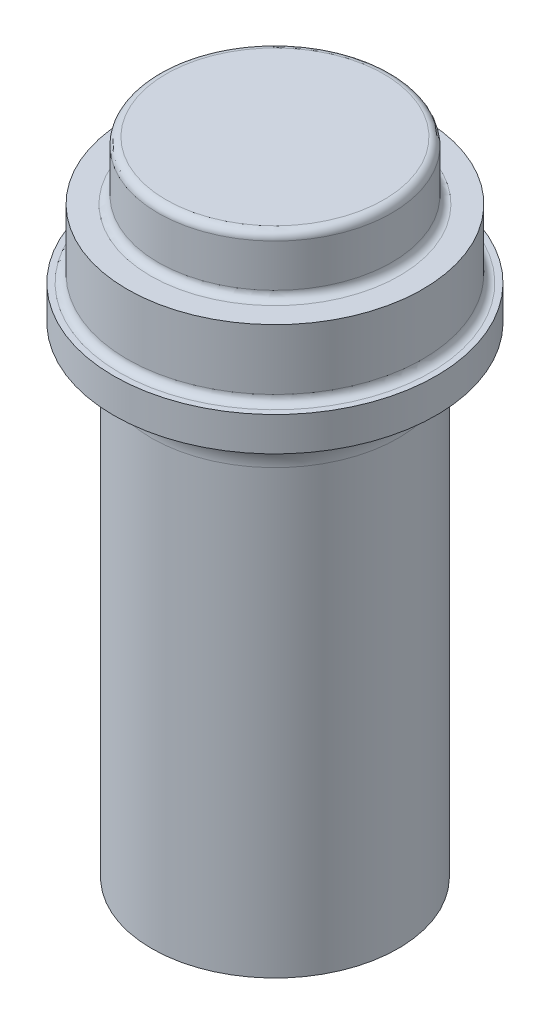
ISO-10303-21;
HEADER;
FILE_DESCRIPTION(('STEP AP214'),'2;1');
FILE_NAME('part.step','',(''),(''),'','','');
FILE_SCHEMA(('AUTOMOTIVE_DESIGN { 1 0 10303 214 1 1 1 1 }'));
ENDSEC;
DATA;
#1=APPLICATION_CONTEXT('core data for automotive mechanical design processes');
#2=APPLICATION_PROTOCOL_DEFINITION('international standard','automotive_design',2000,#1);
#3=PRODUCT_CONTEXT('',#1,'mechanical');
#4=PRODUCT('Part','Part','',(#3));
#5=PRODUCT_RELATED_PRODUCT_CATEGORY('part','',(#4));
#6=PRODUCT_DEFINITION_FORMATION('','',#4);
#7=PRODUCT_DEFINITION_CONTEXT('part definition',#1,'design');
#8=PRODUCT_DEFINITION('design','',#6,#7);
#9=PRODUCT_DEFINITION_SHAPE('','',#8);
#10=(LENGTH_UNIT() NAMED_UNIT(*) SI_UNIT(.MILLI.,.METRE.));
#11=(NAMED_UNIT(*) PLANE_ANGLE_UNIT() SI_UNIT($,.RADIAN.));
#12=(NAMED_UNIT(*) SI_UNIT($,.STERADIAN.) SOLID_ANGLE_UNIT());
#13=UNCERTAINTY_MEASURE_WITH_UNIT(LENGTH_MEASURE(1.E-05),#10,'distance_accuracy_value','');
#14=(GEOMETRIC_REPRESENTATION_CONTEXT(3) GLOBAL_UNCERTAINTY_ASSIGNED_CONTEXT((#13)) GLOBAL_UNIT_ASSIGNED_CONTEXT((#10,
#11,#12)) REPRESENTATION_CONTEXT('',''));
#15=CARTESIAN_POINT('',(0.,0.,0.));
#16=DIRECTION('',(0.,0.,1.));
#17=DIRECTION('',(1.,0.,0.));
#18=AXIS2_PLACEMENT_3D('',#15,#16,#17);
#19=CARTESIAN_POINT('',(0.,62.,0.));
#20=DIRECTION('',(0.,-1.,0.));
#21=DIRECTION('',(0.,0.,-1.));
#22=AXIS2_PLACEMENT_3D('',#19,#20,#21);
#23=CYLINDRICAL_SURFACE('',#22,15.9);
#24=CARTESIAN_POINT('',(0.,57.00100010002,0.));
#25=DIRECTION('',(0.,1.,0.));
#26=DIRECTION('',(0.,0.,1.));
#27=AXIS2_PLACEMENT_3D('',#24,#25,#26);
#28=CIRCLE('',#27,15.9);
#29=CARTESIAN_POINT('',(0.,57.00100010002,15.9));
#30=VERTEX_POINT('',#29);
#31=EDGE_CURVE('E60',#30,#30,#28,.F.);
#32=ORIENTED_EDGE('',*,*,#31,.T.);
#33=EDGE_LOOP('',(#32));
#34=FACE_BOUND('',#33,.T.);
#35=CARTESIAN_POINT('',(0.,0.,0.));
#36=DIRECTION('',(0.,1.,0.));
#37=DIRECTION('',(0.,0.,1.));
#38=AXIS2_PLACEMENT_3D('',#35,#36,#37);
#39=CIRCLE('',#38,15.9);
#40=CARTESIAN_POINT('',(0.,0.,15.9));
#41=VERTEX_POINT('',#40);
#42=EDGE_CURVE('E63',#41,#41,#39,.T.);
#43=ORIENTED_EDGE('',*,*,#42,.T.);
#44=EDGE_LOOP('',(#43));
#45=FACE_BOUND('',#44,.T.);
#46=ADVANCED_FACE('F34',(#34,#45),#23,.T.);
#47=CARTESIAN_POINT('',(0.,0.,0.));
#48=DIRECTION('',(0.,1.,0.));
#49=DIRECTION('',(0.,0.,1.));
#50=AXIS2_PLACEMENT_3D('',#47,#48,#49);
#51=PLANE('',#50);
#52=ORIENTED_EDGE('',*,*,#42,.F.);
#53=EDGE_LOOP('',(#52));
#54=FACE_BOUND('',#53,.T.);
#55=ADVANCED_FACE('F92',(#54),#51,.F.);
#56=CARTESIAN_POINT('',(0.,66.4,0.));
#57=DIRECTION('',(0.,-1.,0.));
#58=DIRECTION('',(0.,0.,-1.));
#59=AXIS2_PLACEMENT_3D('',#56,#57,#58);
#60=CYLINDRICAL_SURFACE('',#59,20.8);
#61=CARTESIAN_POINT('',(0.,66.4,0.));
#62=DIRECTION('',(0.,1.,0.));
#63=DIRECTION('',(0.,0.,1.));
#64=AXIS2_PLACEMENT_3D('',#61,#62,#63);
#65=CIRCLE('',#64,20.8);
#66=CARTESIAN_POINT('',(0.,66.4,20.8));
#67=VERTEX_POINT('',#66);
#68=EDGE_CURVE('E66',#67,#67,#65,.T.);
#69=ORIENTED_EDGE('',*,*,#68,.F.);
#70=EDGE_LOOP('',(#69));
#71=FACE_BOUND('',#70,.T.);
#72=CARTESIAN_POINT('',(0.,62.,0.));
#73=DIRECTION('',(0.,1.,0.));
#74=DIRECTION('',(0.,0.,1.));
#75=AXIS2_PLACEMENT_3D('',#72,#73,#74);
#76=CIRCLE('',#75,20.8);
#77=CARTESIAN_POINT('',(0.,62.,20.8));
#78=VERTEX_POINT('',#77);
#79=EDGE_CURVE('E67',#78,#78,#76,.T.);
#80=ORIENTED_EDGE('',*,*,#79,.T.);
#81=EDGE_LOOP('',(#80));
#82=FACE_BOUND('',#81,.T.);
#83=ADVANCED_FACE('F89',(#71,#82),#60,.T.);
#84=CARTESIAN_POINT('',(0.,66.4,0.));
#85=DIRECTION('',(0.,1.,0.));
#86=DIRECTION('',(0.,0.,1.));
#87=AXIS2_PLACEMENT_3D('',#84,#85,#86);
#88=PLANE('',#87);
#89=CARTESIAN_POINT('',(0.,66.4,0.));
#90=DIRECTION('',(0.,1.,0.));
#91=DIRECTION('',(0.,0.,1.));
#92=AXIS2_PLACEMENT_3D('',#89,#90,#91);
#93=CIRCLE('',#92,20.05);
#94=CARTESIAN_POINT('',(0.,66.4,20.05));
#95=VERTEX_POINT('',#94);
#96=EDGE_CURVE('E10',#95,#95,#93,.F.);
#97=ORIENTED_EDGE('',*,*,#96,.T.);
#98=EDGE_LOOP('',(#97));
#99=FACE_BOUND('',#98,.T.);
#100=ORIENTED_EDGE('',*,*,#68,.T.);
#101=EDGE_LOOP('',(#100));
#102=FACE_BOUND('',#101,.T.);
#103=ADVANCED_FACE('F80',(#99,#102),#88,.T.);
#104=CARTESIAN_POINT('',(0.,75.2,0.));
#105=DIRECTION('',(0.,-1.,0.));
#106=DIRECTION('',(0.,0.,-1.));
#107=AXIS2_PLACEMENT_3D('',#104,#105,#106);
#108=CYLINDRICAL_SURFACE('',#107,19.05);
#109=CARTESIAN_POINT('',(0.,67.4,0.));
#110=DIRECTION('',(0.,1.,0.));
#111=DIRECTION('',(0.,0.,1.));
#112=AXIS2_PLACEMENT_3D('',#109,#110,#111);
#113=CIRCLE('',#112,19.05);
#114=CARTESIAN_POINT('',(0.,67.4,19.05));
#115=VERTEX_POINT('',#114);
#116=EDGE_CURVE('E41',#115,#115,#113,.T.);
#117=ORIENTED_EDGE('',*,*,#116,.T.);
#118=EDGE_LOOP('',(#117));
#119=FACE_BOUND('',#118,.T.);
#120=CARTESIAN_POINT('',(0.,75.2,0.));
#121=DIRECTION('',(0.,1.,0.));
#122=DIRECTION('',(0.,0.,1.));
#123=AXIS2_PLACEMENT_3D('',#120,#121,#122);
#124=CIRCLE('',#123,19.05);
#125=CARTESIAN_POINT('',(0.,75.2,19.05));
#126=VERTEX_POINT('',#125);
#127=EDGE_CURVE('E70',#126,#126,#124,.T.);
#128=ORIENTED_EDGE('',*,*,#127,.F.);
#129=EDGE_LOOP('',(#128));
#130=FACE_BOUND('',#129,.T.);
#131=ADVANCED_FACE('F78',(#119,#130),#108,.T.);
#132=CARTESIAN_POINT('',(0.,75.2,0.));
#133=DIRECTION('',(0.,1.,0.));
#134=DIRECTION('',(0.,0.,1.));
#135=AXIS2_PLACEMENT_3D('',#132,#133,#134);
#136=PLANE('',#135);
#137=CARTESIAN_POINT('',(0.,75.2,0.));
#138=DIRECTION('',(0.,1.,0.));
#139=DIRECTION('',(0.,0.,1.));
#140=AXIS2_PLACEMENT_3D('',#137,#138,#139);
#141=CIRCLE('',#140,16.05);
#142=CARTESIAN_POINT('',(0.,75.2,16.05));
#143=VERTEX_POINT('',#142);
#144=EDGE_CURVE('E45',#143,#143,#141,.F.);
#145=ORIENTED_EDGE('',*,*,#144,.T.);
#146=EDGE_LOOP('',(#145));
#147=FACE_BOUND('',#146,.T.);
#148=ORIENTED_EDGE('',*,*,#127,.T.);
#149=EDGE_LOOP('',(#148));
#150=FACE_BOUND('',#149,.T.);
#151=ADVANCED_FACE('F76',(#147,#150),#136,.T.);
#152=CARTESIAN_POINT('',(0.,82.7,0.));
#153=DIRECTION('',(0.,-1.,0.));
#154=DIRECTION('',(0.,0.,-1.));
#155=AXIS2_PLACEMENT_3D('',#152,#153,#154);
#156=CYLINDRICAL_SURFACE('',#155,15.05);
#157=CARTESIAN_POINT('',(0.,81.7,0.));
#158=DIRECTION('',(0.,1.,0.));
#159=DIRECTION('',(0.,0.,1.));
#160=AXIS2_PLACEMENT_3D('',#157,#158,#159);
#161=CIRCLE('',#160,15.05);
#162=CARTESIAN_POINT('',(0.,81.7,15.05));
#163=VERTEX_POINT('',#162);
#164=EDGE_CURVE('E49',#163,#163,#161,.F.);
#165=ORIENTED_EDGE('',*,*,#164,.T.);
#166=EDGE_LOOP('',(#165));
#167=FACE_BOUND('',#166,.T.);
#168=CARTESIAN_POINT('',(0.,76.2,0.));
#169=DIRECTION('',(0.,1.,0.));
#170=DIRECTION('',(0.,0.,1.));
#171=AXIS2_PLACEMENT_3D('',#168,#169,#170);
#172=CIRCLE('',#171,15.05);
#173=CARTESIAN_POINT('',(0.,76.2,15.05));
#174=VERTEX_POINT('',#173);
#175=EDGE_CURVE('E54',#174,#174,#172,.T.);
#176=ORIENTED_EDGE('',*,*,#175,.T.);
#177=EDGE_LOOP('',(#176));
#178=FACE_BOUND('',#177,.T.);
#179=ADVANCED_FACE('F86',(#167,#178),#156,.T.);
#180=CARTESIAN_POINT('',(0.,82.7,0.));
#181=DIRECTION('',(0.,1.,0.));
#182=DIRECTION('',(0.,0.,1.));
#183=AXIS2_PLACEMENT_3D('',#180,#181,#182);
#184=PLANE('',#183);
#185=CARTESIAN_POINT('',(0.,82.7,0.));
#186=DIRECTION('',(0.,1.,0.));
#187=DIRECTION('',(0.,0.,1.));
#188=AXIS2_PLACEMENT_3D('',#185,#186,#187);
#189=CIRCLE('',#188,14.05);
#190=CARTESIAN_POINT('',(0.,82.7,14.05));
#191=VERTEX_POINT('',#190);
#192=EDGE_CURVE('E57',#191,#191,#189,.T.);
#193=ORIENTED_EDGE('',*,*,#192,.T.);
#194=EDGE_LOOP('',(#193));
#195=FACE_BOUND('',#194,.T.);
#196=ADVANCED_FACE('F107',(#195),#184,.T.);
#197=CARTESIAN_POINT('',(0.,57.00100010002,0.));
#198=DIRECTION('',(0.,1.,0.));
#199=DIRECTION('',(0.,0.,1.));
#200=AXIS2_PLACEMENT_3D('',#197,#198,#199);
#201=TOROIDAL_SURFACE('',#200,20.9,5.);
#202=ORIENTED_EDGE('',*,*,#31,.F.);
#203=EDGE_LOOP('',(#202));
#204=FACE_BOUND('',#203,.T.);
#205=ORIENTED_EDGE('',*,*,#79,.F.);
#206=EDGE_LOOP('',(#205));
#207=FACE_BOUND('',#206,.T.);
#208=ADVANCED_FACE('F103',(#204,#207),#201,.F.);
#209=CARTESIAN_POINT('',(0.,81.7,0.));
#210=DIRECTION('',(0.,1.,0.));
#211=DIRECTION('',(0.,0.,1.));
#212=AXIS2_PLACEMENT_3D('',#209,#210,#211);
#213=TOROIDAL_SURFACE('',#212,14.05,1.);
#214=ORIENTED_EDGE('',*,*,#164,.F.);
#215=EDGE_LOOP('',(#214));
#216=FACE_BOUND('',#215,.T.);
#217=ORIENTED_EDGE('',*,*,#192,.F.);
#218=EDGE_LOOP('',(#217));
#219=FACE_BOUND('',#218,.T.);
#220=ADVANCED_FACE('F106',(#216,#219),#213,.T.);
#221=CARTESIAN_POINT('',(0.,76.2,0.));
#222=DIRECTION('',(0.,1.,0.));
#223=DIRECTION('',(0.,0.,1.));
#224=AXIS2_PLACEMENT_3D('',#221,#222,#223);
#225=TOROIDAL_SURFACE('',#224,16.05,1.);
#226=ORIENTED_EDGE('',*,*,#144,.F.);
#227=EDGE_LOOP('',(#226));
#228=FACE_BOUND('',#227,.T.);
#229=ORIENTED_EDGE('',*,*,#175,.F.);
#230=EDGE_LOOP('',(#229));
#231=FACE_BOUND('',#230,.T.);
#232=ADVANCED_FACE('F110',(#228,#231),#225,.F.);
#233=CARTESIAN_POINT('',(0.,67.4,0.));
#234=DIRECTION('',(0.,1.,0.));
#235=DIRECTION('',(0.,0.,1.));
#236=AXIS2_PLACEMENT_3D('',#233,#234,#235);
#237=TOROIDAL_SURFACE('',#236,20.05,1.);
#238=ORIENTED_EDGE('',*,*,#96,.F.);
#239=EDGE_LOOP('',(#238));
#240=FACE_BOUND('',#239,.T.);
#241=ORIENTED_EDGE('',*,*,#116,.F.);
#242=EDGE_LOOP('',(#241));
#243=FACE_BOUND('',#242,.T.);
#244=ADVANCED_FACE('F36',(#240,#243),#237,.F.);
#245=CLOSED_SHELL('',(#46,#55,#83,#103,#131,#151,#179,#196,#208,#220,#232,#244));
#246=MANIFOLD_SOLID_BREP('B2',#245);
#247=ADVANCED_BREP_SHAPE_REPRESENTATION('',(#18,#246),#14);
#248=SHAPE_DEFINITION_REPRESENTATION(#9,#247);
ENDSEC;
END-ISO-10303-21;
